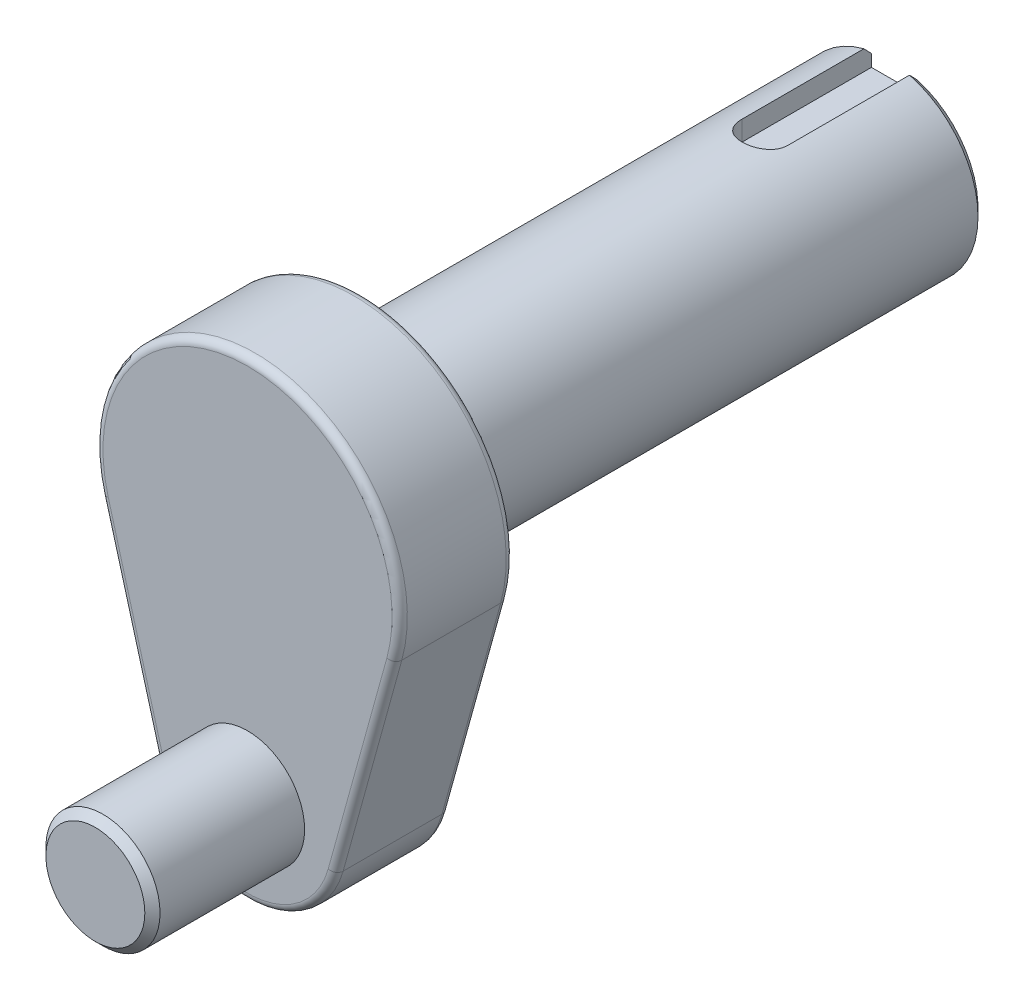
ISO-10303-21;
HEADER;
FILE_DESCRIPTION(('STEP AP214'),'2;1');
FILE_NAME('part.step','',(''),(''),'','','');
FILE_SCHEMA(('AUTOMOTIVE_DESIGN { 1 0 10303 214 1 1 1 1 }'));
ENDSEC;
DATA;
#1=APPLICATION_CONTEXT('core data for automotive mechanical design processes');
#2=APPLICATION_PROTOCOL_DEFINITION('international standard','automotive_design',2000,#1);
#3=PRODUCT_CONTEXT('',#1,'mechanical');
#4=PRODUCT('Part','Part','',(#3));
#5=PRODUCT_RELATED_PRODUCT_CATEGORY('part','',(#4));
#6=PRODUCT_DEFINITION_FORMATION('','',#4);
#7=PRODUCT_DEFINITION_CONTEXT('part definition',#1,'design');
#8=PRODUCT_DEFINITION('design','',#6,#7);
#9=PRODUCT_DEFINITION_SHAPE('','',#8);
#10=(LENGTH_UNIT() NAMED_UNIT(*) SI_UNIT(.MILLI.,.METRE.));
#11=(NAMED_UNIT(*) PLANE_ANGLE_UNIT() SI_UNIT($,.RADIAN.));
#12=(NAMED_UNIT(*) SI_UNIT($,.STERADIAN.) SOLID_ANGLE_UNIT());
#13=UNCERTAINTY_MEASURE_WITH_UNIT(LENGTH_MEASURE(1.E-05),#10,'distance_accuracy_value','');
#14=(GEOMETRIC_REPRESENTATION_CONTEXT(3) GLOBAL_UNCERTAINTY_ASSIGNED_CONTEXT((#13)) GLOBAL_UNIT_ASSIGNED_CONTEXT((#10,
#11,#12)) REPRESENTATION_CONTEXT('',''));
#15=CARTESIAN_POINT('',(0.,0.,0.));
#16=DIRECTION('',(0.,0.,1.));
#17=DIRECTION('',(1.,0.,0.));
#18=AXIS2_PLACEMENT_3D('',#15,#16,#17);
#19=CARTESIAN_POINT('',(0.,5.80947501931113,-26.5));
#20=DIRECTION('',(0.,1.,0.));
#21=DIRECTION('',(0.,0.,1.));
#22=AXIS2_PLACEMENT_3D('',#19,#20,#21);
#23=CYLINDRICAL_SURFACE('',#22,1.5);
#24=DIRECTION('',(0.,1.,0.));
#25=VECTOR('',#24,1.);
#26=CARTESIAN_POINT('',(-1.5,7.50000000000001,-26.5));
#27=LINE('',#26,#25);
#28=CARTESIAN_POINT('',(-1.5,5.80947501931113,-26.5));
#29=VERTEX_POINT('',#28);
#30=CARTESIAN_POINT('',(-1.5,4.5,-26.5));
#31=VERTEX_POINT('',#30);
#32=EDGE_CURVE('E390',#29,#31,#27,.F.);
#33=ORIENTED_EDGE('',*,*,#32,.F.);
#34=CARTESIAN_POINT('',(1.5,5.80947501931111,-26.5));
#35=CARTESIAN_POINT('',(1.50000050524923,5.80947222867943,-26.4585055571708));
#36=CARTESIAN_POINT('',(1.49827711346028,5.8099201484777,-26.4170316750747));
#37=CARTESIAN_POINT('',(1.49140695796285,5.81168856794097,-26.3343940851127));
#38=CARTESIAN_POINT('',(1.4862607702814,5.81300892078276,-26.2932303262343));
#39=CARTESIAN_POINT('',(1.46576289126512,5.8182256559059,-26.1708203749852));
#40=CARTESIAN_POINT('',(1.44535155552794,5.82337804135511,-26.0904153630816));
#41=CARTESIAN_POINT('',(1.39169664999631,5.83643145456575,-25.9343116096195));
#42=CARTESIAN_POINT('',(1.35845407001292,5.8443322703067,-25.8586125055667));
#43=CARTESIAN_POINT('',(1.28012142761861,5.86198736230108,-25.7138303703552));
#44=CARTESIAN_POINT('',(1.23502860644179,5.87174206999863,-25.6447488849113));
#45=CARTESIAN_POINT('',(1.1332319688719,5.89224290917559,-25.5136907703432));
#46=CARTESIAN_POINT('',(1.07631780220301,5.90300473123246,-25.4518800320828));
#47=CARTESIAN_POINT('',(0.952926341290179,5.92417448469618,-25.3385570685535));
#48=CARTESIAN_POINT('',(0.88644562907482,5.93458228796763,-25.2870485398838));
#49=CARTESIAN_POINT('',(0.744651529893638,5.95404769921051,-25.1951104129951));
#50=CARTESIAN_POINT('',(0.669225052680382,5.96308378123932,-25.1548504608458));
#51=CARTESIAN_POINT('',(0.512463474576597,5.97859165785743,-25.0876847147731));
#52=CARTESIAN_POINT('',(0.431135590578427,5.98506652406555,-25.0607629148016));
#53=CARTESIAN_POINT('',(0.291167603440451,5.99320337580397,-25.027365800933));
#54=CARTESIAN_POINT('',(0.233449377030623,5.99573891848001,-25.017121309968));
#55=CARTESIAN_POINT('',(0.117162004167823,5.99913797373967,-25.0034371887798));
#56=CARTESIAN_POINT('',(0.0585928701337026,6.00000151070128,-24.9999974593426));
#57=CARTESIAN_POINT('',(-0.082847618974071,5.99999786393799,-25.0000035923725));
#58=CARTESIAN_POINT('',(-0.165742692717238,5.9982662677415,-25.0068891973278));
#59=CARTESIAN_POINT('',(-0.329178448850621,5.99152326745466,-25.0342169072882));
#60=CARTESIAN_POINT('',(-0.409716811091393,5.98650873780841,-25.0546719314673));
#61=CARTESIAN_POINT('',(-0.566022324045833,5.97375602287717,-25.1084401334819));
#62=CARTESIAN_POINT('',(-0.641795822888291,5.9660215559967,-25.1417357630046));
#63=CARTESIAN_POINT('',(-0.786676474014416,5.9486528792089,-25.220184083389));
#64=CARTESIAN_POINT('',(-0.855783795796267,5.93901871762332,-25.265336472665));
#65=CARTESIAN_POINT('',(-0.986800306585114,5.91867437595091,-25.3671994555513));
#66=CARTESIAN_POINT('',(-1.04855272336329,5.90794759014857,-25.4241083767118));
#67=CARTESIAN_POINT('',(-1.16174664413941,5.88673666629444,-25.5474496827367));
#68=CARTESIAN_POINT('',(-1.213186506477,5.87625256711063,-25.6138835810042));
#69=CARTESIAN_POINT('',(-1.30503992634644,5.85654489816704,-25.755614268944));
#70=CARTESIAN_POINT('',(-1.34527483807535,5.8473428055162,-25.831029969388));
#71=CARTESIAN_POINT('',(-1.41241423980361,5.83149065240361,-25.9878049420868));
#72=CARTESIAN_POINT('',(-1.43932873841843,5.82483867669934,-26.0691596989821));
#73=CARTESIAN_POINT('',(-1.47268958608266,5.81647517608708,-26.2091256997767));
#74=CARTESIAN_POINT('',(-1.48291503731536,5.81386697661189,-26.2668105309544));
#75=CARTESIAN_POINT('',(-1.49657449812415,5.81035954220756,-26.3829865321373));
#76=CARTESIAN_POINT('',(-1.50001339891543,5.80945907649565,-26.441477090798));
#77=CARTESIAN_POINT('',(-1.5,5.80947501931113,-26.5));
#78=B_SPLINE_CURVE_WITH_KNOTS('',3,(#34,#35,#36,#37,#38,#39,#40,#41,#42,#43,#44,#45,#46,#47,#48,
#49,#50,#51,#52,#53,#54,#55,#56,#57,#58,#59,#60,#61,#62,#63,#64,#65,#66,#67,#68,#69,#70,#71,#72,
#73,#74,#75,#76,#77),.UNSPECIFIED.,.F.,.F.,(4,2,2,2,2,2,2,2,2,2,2,2,2,2,2,2,2,2,2,2,2,4),(0.,
0.124404691229613,0.248788451518705,0.496844944064961,0.744882305184763,0.992977461256862,
1.24593774314179,1.49898862906734,1.75567193684104,2.0120464689173,2.18767408469901,
2.36329913979516,2.61162487659784,2.86018737936107,3.10841138690879,3.3566290813007,
3.60943765267769,3.86228643686803,4.11896167430954,4.37544375867517,4.55097061014466,
4.72637090930917),.UNSPECIFIED.);
#79=CARTESIAN_POINT('',(1.5,5.80947501931111,-26.5));
#80=VERTEX_POINT('',#79);
#81=EDGE_CURVE('E267',#29,#80,#78,.F.);
#82=ORIENTED_EDGE('',*,*,#81,.T.);
#83=DIRECTION('',(0.,1.,0.));
#84=VECTOR('',#83,1.);
#85=CARTESIAN_POINT('',(1.5,7.5,-26.5));
#86=LINE('',#85,#84);
#87=CARTESIAN_POINT('',(1.5,4.5,-26.5));
#88=VERTEX_POINT('',#87);
#89=EDGE_CURVE('E391',#88,#80,#86,.T.);
#90=ORIENTED_EDGE('',*,*,#89,.F.);
#91=CARTESIAN_POINT('',(0.,4.5,-26.5));
#92=DIRECTION('',(0.,-1.,0.));
#93=DIRECTION('',(0.,0.,-1.));
#94=AXIS2_PLACEMENT_3D('',#91,#92,#93);
#95=CIRCLE('',#94,1.5);
#96=EDGE_CURVE('E145',#31,#88,#95,.F.);
#97=ORIENTED_EDGE('',*,*,#96,.F.);
#98=EDGE_LOOP('',(#33,#82,#90,#97));
#99=FACE_BOUND('',#98,.T.);
#100=ADVANCED_FACE('F40',(#99),#23,.F.);
#101=CARTESIAN_POINT('',(0.,0.,-35.));
#102=DIRECTION('',(0.,0.,1.));
#103=DIRECTION('',(1.,0.,0.));
#104=AXIS2_PLACEMENT_3D('',#101,#102,#103);
#105=CYLINDRICAL_SURFACE('',#104,6.);
#106=ORIENTED_EDGE('',*,*,#81,.F.);
#107=DIRECTION('',(0.,0.,1.));
#108=VECTOR('',#107,1.);
#109=CARTESIAN_POINT('',(-1.5,5.80947501931113,-35.));
#110=LINE('',#109,#108);
#111=CARTESIAN_POINT('',(-1.5,5.80947501931113,-34.5));
#112=VERTEX_POINT('',#111);
#113=EDGE_CURVE('E168',#112,#29,#110,.T.);
#114=ORIENTED_EDGE('',*,*,#113,.F.);
#115=CARTESIAN_POINT('',(0.,0.,-34.5));
#116=DIRECTION('',(0.,0.,1.));
#117=DIRECTION('',(1.,0.,0.));
#118=AXIS2_PLACEMENT_3D('',#115,#116,#117);
#119=CIRCLE('',#118,6.);
#120=CARTESIAN_POINT('',(1.5,5.80947501931111,-34.5));
#121=VERTEX_POINT('',#120);
#122=EDGE_CURVE('E196',#112,#121,#119,.T.);
#123=ORIENTED_EDGE('',*,*,#122,.T.);
#124=DIRECTION('',(0.,0.,1.));
#125=VECTOR('',#124,1.);
#126=CARTESIAN_POINT('',(1.5,5.80947501931111,-35.));
#127=LINE('',#126,#125);
#128=EDGE_CURVE('E165',#80,#121,#127,.F.);
#129=ORIENTED_EDGE('',*,*,#128,.F.);
#130=EDGE_LOOP('',(#106,#114,#123,#129));
#131=FACE_BOUND('',#130,.T.);
#132=CARTESIAN_POINT('',(0.,0.,0.));
#133=DIRECTION('',(0.,0.,1.));
#134=DIRECTION('',(1.,0.,0.));
#135=AXIS2_PLACEMENT_3D('',#132,#133,#134);
#136=CIRCLE('',#135,6.);
#137=CARTESIAN_POINT('',(6.00000000000001,0.,0.));
#138=VERTEX_POINT('',#137);
#139=EDGE_CURVE('E186',#138,#138,#136,.T.);
#140=ORIENTED_EDGE('',*,*,#139,.F.);
#141=EDGE_LOOP('',(#140));
#142=FACE_BOUND('',#141,.T.);
#143=ADVANCED_FACE('F262',(#131,#142),#105,.T.);
#144=CARTESIAN_POINT('',(0.,0.,-35.));
#145=DIRECTION('',(0.,0.,1.));
#146=DIRECTION('',(1.,0.,0.));
#147=AXIS2_PLACEMENT_3D('',#144,#145,#146);
#148=PLANE('',#147);
#149=CARTESIAN_POINT('',(0.,0.,-35.));
#150=DIRECTION('',(0.,0.,1.));
#151=DIRECTION('',(1.,0.,0.));
#152=AXIS2_PLACEMENT_3D('',#149,#150,#151);
#153=CIRCLE('',#152,5.50000000000001);
#154=CARTESIAN_POINT('',(1.5,5.29150262212917,-35.));
#155=VERTEX_POINT('',#154);
#156=CARTESIAN_POINT('',(-1.5,5.29150262212918,-35.));
#157=VERTEX_POINT('',#156);
#158=EDGE_CURVE('E199',#155,#157,#153,.F.);
#159=ORIENTED_EDGE('',*,*,#158,.T.);
#160=DIRECTION('',(0.,1.,0.));
#161=VECTOR('',#160,1.);
#162=CARTESIAN_POINT('',(-1.5,7.50000000000001,-35.));
#163=LINE('',#162,#161);
#164=CARTESIAN_POINT('',(-1.5,4.5,-35.));
#165=VERTEX_POINT('',#164);
#166=EDGE_CURVE('E159',#165,#157,#163,.T.);
#167=ORIENTED_EDGE('',*,*,#166,.F.);
#168=DIRECTION('',(-1.,0.,0.));
#169=VECTOR('',#168,1.);
#170=CARTESIAN_POINT('',(1.5,4.5,-35.));
#171=LINE('',#170,#169);
#172=CARTESIAN_POINT('',(1.5,4.5,-35.));
#173=VERTEX_POINT('',#172);
#174=EDGE_CURVE('E143',#173,#165,#171,.T.);
#175=ORIENTED_EDGE('',*,*,#174,.F.);
#176=DIRECTION('',(0.,-1.,0.));
#177=VECTOR('',#176,1.);
#178=CARTESIAN_POINT('',(1.5,7.5,-35.));
#179=LINE('',#178,#177);
#180=EDGE_CURVE('E152',#155,#173,#179,.T.);
#181=ORIENTED_EDGE('',*,*,#180,.F.);
#182=EDGE_LOOP('',(#159,#167,#175,#181));
#183=FACE_BOUND('',#182,.T.);
#184=ADVANCED_FACE('F161',(#183),#148,.F.);
#185=CARTESIAN_POINT('',(0.,-15.,7.5));
#186=DIRECTION('',(0.,0.,-1.));
#187=DIRECTION('',(-1.,0.,0.));
#188=AXIS2_PLACEMENT_3D('',#185,#186,#187);
#189=CYLINDRICAL_SURFACE('',#188,6.);
#190=DIRECTION('',(0.,0.,-1.));
#191=VECTOR('',#190,1.);
#192=CARTESIAN_POINT('',(5.78273291792039,-16.6,7.5));
#193=LINE('',#192,#191);
#194=CARTESIAN_POINT('',(5.78273291792039,-16.6,7.));
#195=VERTEX_POINT('',#194);
#196=CARTESIAN_POINT('',(5.78273291792039,-16.6,0.5));
#197=VERTEX_POINT('',#196);
#198=EDGE_CURVE('E183',#195,#197,#193,.T.);
#199=ORIENTED_EDGE('',*,*,#198,.F.);
#200=CARTESIAN_POINT('',(0.,-15.,7.));
#201=DIRECTION('',(0.,0.,1.));
#202=DIRECTION('',(1.,0.,0.));
#203=AXIS2_PLACEMENT_3D('',#200,#201,#202);
#204=CIRCLE('',#203,6.);
#205=CARTESIAN_POINT('',(-5.78273291792039,-16.6,7.));
#206=VERTEX_POINT('',#205);
#207=EDGE_CURVE('E348',#195,#206,#204,.F.);
#208=ORIENTED_EDGE('',*,*,#207,.T.);
#209=DIRECTION('',(0.,0.,-1.));
#210=VECTOR('',#209,1.);
#211=CARTESIAN_POINT('',(-5.78273291792039,-16.6,7.5));
#212=LINE('',#211,#210);
#213=CARTESIAN_POINT('',(-5.78273291792039,-16.6,0.5));
#214=VERTEX_POINT('',#213);
#215=EDGE_CURVE('E174',#206,#214,#212,.T.);
#216=ORIENTED_EDGE('',*,*,#215,.T.);
#217=CARTESIAN_POINT('',(0.,-15.,0.5));
#218=DIRECTION('',(0.,0.,1.));
#219=DIRECTION('',(1.,0.,0.));
#220=AXIS2_PLACEMENT_3D('',#217,#218,#219);
#221=CIRCLE('',#220,6.);
#222=EDGE_CURVE('E315',#214,#197,#221,.T.);
#223=ORIENTED_EDGE('',*,*,#222,.T.);
#224=EDGE_LOOP('',(#199,#208,#216,#223));
#225=FACE_BOUND('',#224,.T.);
#226=ADVANCED_FACE('F255',(#225),#189,.T.);
#227=CARTESIAN_POINT('',(9.63788819653399,-2.66666666666669,7.5));
#228=DIRECTION('',(-0.963788819653399,0.266666666666667,0.));
#229=DIRECTION('',(-0.266666666666667,-0.963788819653399,0.));
#230=AXIS2_PLACEMENT_3D('',#227,#228,#229);
#231=PLANE('',#230);
#232=DIRECTION('',(0.,0.,-1.));
#233=VECTOR('',#232,1.);
#234=CARTESIAN_POINT('',(9.63788819653399,-2.66666666666669,7.5));
#235=LINE('',#234,#233);
#236=CARTESIAN_POINT('',(9.63788819653399,-2.66666666666669,7.));
#237=VERTEX_POINT('',#236);
#238=CARTESIAN_POINT('',(9.63788819653399,-2.66666666666669,0.5));
#239=VERTEX_POINT('',#238);
#240=EDGE_CURVE('E180',#237,#239,#235,.T.);
#241=ORIENTED_EDGE('',*,*,#240,.F.);
#242=DIRECTION('',(0.266666666666667,0.963788819653399,0.));
#243=VECTOR('',#242,1.);
#244=CARTESIAN_POINT('',(5.78273291792039,-16.6,7.));
#245=LINE('',#244,#243);
#246=EDGE_CURVE('E351',#237,#195,#245,.F.);
#247=ORIENTED_EDGE('',*,*,#246,.T.);
#248=ORIENTED_EDGE('',*,*,#198,.T.);
#249=DIRECTION('',(0.266666666666667,0.963788819653399,0.));
#250=VECTOR('',#249,1.);
#251=CARTESIAN_POINT('',(9.63788819653399,-2.66666666666669,0.5));
#252=LINE('',#251,#250);
#253=EDGE_CURVE('E354',#197,#239,#252,.T.);
#254=ORIENTED_EDGE('',*,*,#253,.T.);
#255=EDGE_LOOP('',(#241,#247,#248,#254));
#256=FACE_BOUND('',#255,.T.);
#257=ADVANCED_FACE('F251',(#256),#231,.F.);
#258=CARTESIAN_POINT('',(0.,0.,7.5));
#259=DIRECTION('',(0.,0.,-1.));
#260=DIRECTION('',(-1.,0.,0.));
#261=AXIS2_PLACEMENT_3D('',#258,#259,#260);
#262=CYLINDRICAL_SURFACE('',#261,10.);
#263=DIRECTION('',(0.,0.,-1.));
#264=VECTOR('',#263,1.);
#265=CARTESIAN_POINT('',(-9.63788819653399,-2.66666666666669,7.5));
#266=LINE('',#265,#264);
#267=CARTESIAN_POINT('',(-9.63788819653399,-2.66666666666669,7.));
#268=VERTEX_POINT('',#267);
#269=CARTESIAN_POINT('',(-9.63788819653399,-2.66666666666669,0.5));
#270=VERTEX_POINT('',#269);
#271=EDGE_CURVE('E177',#268,#270,#266,.T.);
#272=ORIENTED_EDGE('',*,*,#271,.F.);
#273=CARTESIAN_POINT('',(0.,0.,7.));
#274=DIRECTION('',(0.,0.,1.));
#275=DIRECTION('',(1.,0.,0.));
#276=AXIS2_PLACEMENT_3D('',#273,#274,#275);
#277=CIRCLE('',#276,10.);
#278=EDGE_CURVE('E11',#268,#237,#277,.F.);
#279=ORIENTED_EDGE('',*,*,#278,.T.);
#280=ORIENTED_EDGE('',*,*,#240,.T.);
#281=CARTESIAN_POINT('',(0.,0.,0.5));
#282=DIRECTION('',(0.,0.,1.));
#283=DIRECTION('',(1.,0.,0.));
#284=AXIS2_PLACEMENT_3D('',#281,#282,#283);
#285=CIRCLE('',#284,10.);
#286=EDGE_CURVE('E49',#239,#270,#285,.T.);
#287=ORIENTED_EDGE('',*,*,#286,.T.);
#288=EDGE_LOOP('',(#272,#279,#280,#287));
#289=FACE_BOUND('',#288,.T.);
#290=ADVANCED_FACE('F247',(#289),#262,.T.);
#291=CARTESIAN_POINT('',(-9.63788819653399,-2.66666666666669,7.5));
#292=DIRECTION('',(0.963788819653399,0.266666666666667,0.));
#293=DIRECTION('',(-0.266666666666667,0.963788819653399,0.));
#294=AXIS2_PLACEMENT_3D('',#291,#292,#293);
#295=PLANE('',#294);
#296=ORIENTED_EDGE('',*,*,#215,.F.);
#297=DIRECTION('',(0.266666666666667,-0.963788819653399,0.));
#298=VECTOR('',#297,1.);
#299=CARTESIAN_POINT('',(-9.63788819653399,-2.66666666666669,7.));
#300=LINE('',#299,#298);
#301=EDGE_CURVE('E344',#206,#268,#300,.F.);
#302=ORIENTED_EDGE('',*,*,#301,.T.);
#303=ORIENTED_EDGE('',*,*,#271,.T.);
#304=DIRECTION('',(0.266666666666667,-0.963788819653399,0.));
#305=VECTOR('',#304,1.);
#306=CARTESIAN_POINT('',(-9.63788819653399,-2.66666666666669,0.5));
#307=LINE('',#306,#305);
#308=EDGE_CURVE('E346',#270,#214,#307,.T.);
#309=ORIENTED_EDGE('',*,*,#308,.T.);
#310=EDGE_LOOP('',(#296,#302,#303,#309));
#311=FACE_BOUND('',#310,.T.);
#312=ADVANCED_FACE('F241',(#311),#295,.F.);
#313=CARTESIAN_POINT('',(0.,-15.,7.5));
#314=DIRECTION('',(0.,0.,1.));
#315=DIRECTION('',(1.,0.,0.));
#316=AXIS2_PLACEMENT_3D('',#313,#314,#315);
#317=PLANE('',#316);
#318=CARTESIAN_POINT('',(0.,-15.,7.5));
#319=DIRECTION('',(0.,0.,1.));
#320=DIRECTION('',(1.,0.,0.));
#321=AXIS2_PLACEMENT_3D('',#318,#319,#320);
#322=CIRCLE('',#321,5.5);
#323=CARTESIAN_POINT('',(-5.30083850809369,-16.4666666666667,7.5));
#324=VERTEX_POINT('',#323);
#325=CARTESIAN_POINT('',(5.30083850809369,-16.4666666666667,7.5));
#326=VERTEX_POINT('',#325);
#327=EDGE_CURVE('E360',#324,#326,#322,.T.);
#328=ORIENTED_EDGE('',*,*,#327,.T.);
#329=DIRECTION('',(0.266666666666667,0.963788819653399,0.));
#330=VECTOR('',#329,1.);
#331=CARTESIAN_POINT('',(9.15599378670728,-2.53333333333333,7.5));
#332=LINE('',#331,#330);
#333=CARTESIAN_POINT('',(9.15599378670728,-2.53333333333333,7.5));
#334=VERTEX_POINT('',#333);
#335=EDGE_CURVE('E357',#326,#334,#332,.T.);
#336=ORIENTED_EDGE('',*,*,#335,.T.);
#337=CARTESIAN_POINT('',(0.,0.,7.5));
#338=DIRECTION('',(0.,0.,1.));
#339=DIRECTION('',(1.,0.,0.));
#340=AXIS2_PLACEMENT_3D('',#337,#338,#339);
#341=CIRCLE('',#340,9.5);
#342=CARTESIAN_POINT('',(-9.15599378670728,-2.53333333333335,7.5));
#343=VERTEX_POINT('',#342);
#344=EDGE_CURVE('E274',#334,#343,#341,.T.);
#345=ORIENTED_EDGE('',*,*,#344,.T.);
#346=DIRECTION('',(0.266666666666667,-0.963788819653399,0.));
#347=VECTOR('',#346,1.);
#348=CARTESIAN_POINT('',(-5.30083850809369,-16.4666666666667,7.5));
#349=LINE('',#348,#347);
#350=EDGE_CURVE('E361',#343,#324,#349,.T.);
#351=ORIENTED_EDGE('',*,*,#350,.T.);
#352=EDGE_LOOP('',(#328,#336,#345,#351));
#353=FACE_BOUND('',#352,.T.);
#354=CARTESIAN_POINT('',(0.,-15.,7.5));
#355=DIRECTION('',(0.,0.,1.));
#356=DIRECTION('',(1.,0.,0.));
#357=AXIS2_PLACEMENT_3D('',#354,#355,#356);
#358=CIRCLE('',#357,3.75);
#359=CARTESIAN_POINT('',(3.75000000000001,-15.,7.5));
#360=VERTEX_POINT('',#359);
#361=EDGE_CURVE('E171',#360,#360,#358,.T.);
#362=ORIENTED_EDGE('',*,*,#361,.F.);
#363=EDGE_LOOP('',(#362));
#364=FACE_BOUND('',#363,.T.);
#365=ADVANCED_FACE('F238',(#353,#364),#317,.T.);
#366=CARTESIAN_POINT('',(0.,-15.,0.));
#367=DIRECTION('',(0.,0.,1.));
#368=DIRECTION('',(1.,0.,0.));
#369=AXIS2_PLACEMENT_3D('',#366,#367,#368);
#370=PLANE('',#369);
#371=CARTESIAN_POINT('',(0.,0.,0.));
#372=DIRECTION('',(0.,0.,1.));
#373=DIRECTION('',(1.,0.,0.));
#374=AXIS2_PLACEMENT_3D('',#371,#372,#373);
#375=CIRCLE('',#374,9.5);
#376=CARTESIAN_POINT('',(-9.15599378670728,-2.53333333333335,0.));
#377=VERTEX_POINT('',#376);
#378=CARTESIAN_POINT('',(9.15599378670728,-2.53333333333333,0.));
#379=VERTEX_POINT('',#378);
#380=EDGE_CURVE('E342',#377,#379,#375,.F.);
#381=ORIENTED_EDGE('',*,*,#380,.T.);
#382=DIRECTION('',(0.266666666666667,0.963788819653399,0.));
#383=VECTOR('',#382,1.);
#384=CARTESIAN_POINT('',(5.30083850809369,-16.4666666666667,0.));
#385=LINE('',#384,#383);
#386=CARTESIAN_POINT('',(5.30083850809369,-16.4666666666667,0.));
#387=VERTEX_POINT('',#386);
#388=EDGE_CURVE('E337',#379,#387,#385,.F.);
#389=ORIENTED_EDGE('',*,*,#388,.T.);
#390=CARTESIAN_POINT('',(0.,-15.,0.));
#391=DIRECTION('',(0.,0.,1.));
#392=DIRECTION('',(1.,0.,0.));
#393=AXIS2_PLACEMENT_3D('',#390,#391,#392);
#394=CIRCLE('',#393,5.5);
#395=CARTESIAN_POINT('',(-5.30083850809369,-16.4666666666667,0.));
#396=VERTEX_POINT('',#395);
#397=EDGE_CURVE('E64',#387,#396,#394,.F.);
#398=ORIENTED_EDGE('',*,*,#397,.T.);
#399=DIRECTION('',(0.266666666666667,-0.963788819653399,0.));
#400=VECTOR('',#399,1.);
#401=CARTESIAN_POINT('',(-5.30083850809369,-16.4666666666667,0.));
#402=LINE('',#401,#400);
#403=EDGE_CURVE('E340',#396,#377,#402,.F.);
#404=ORIENTED_EDGE('',*,*,#403,.T.);
#405=EDGE_LOOP('',(#381,#389,#398,#404));
#406=FACE_BOUND('',#405,.T.);
#407=ORIENTED_EDGE('',*,*,#139,.T.);
#408=EDGE_LOOP('',(#407));
#409=FACE_BOUND('',#408,.T.);
#410=ADVANCED_FACE('F236',(#406,#409),#370,.F.);
#411=CARTESIAN_POINT('',(0.,-15.,17.5));
#412=DIRECTION('',(0.,0.,-1.));
#413=DIRECTION('',(-1.,0.,0.));
#414=AXIS2_PLACEMENT_3D('',#411,#412,#413);
#415=CYLINDRICAL_SURFACE('',#414,3.75);
#416=CARTESIAN_POINT('',(0.,-15.,17.));
#417=DIRECTION('',(0.,0.,1.));
#418=DIRECTION('',(1.,0.,0.));
#419=AXIS2_PLACEMENT_3D('',#416,#417,#418);
#420=CIRCLE('',#419,3.75);
#421=CARTESIAN_POINT('',(3.75000000000001,-15.,17.));
#422=VERTEX_POINT('',#421);
#423=EDGE_CURVE('E193',#422,#422,#420,.F.);
#424=ORIENTED_EDGE('',*,*,#423,.T.);
#425=EDGE_LOOP('',(#424));
#426=FACE_BOUND('',#425,.T.);
#427=ORIENTED_EDGE('',*,*,#361,.T.);
#428=EDGE_LOOP('',(#427));
#429=FACE_BOUND('',#428,.T.);
#430=ADVANCED_FACE('F232',(#426,#429),#415,.T.);
#431=CARTESIAN_POINT('',(0.,-15.,17.5));
#432=DIRECTION('',(0.,0.,1.));
#433=DIRECTION('',(1.,0.,0.));
#434=AXIS2_PLACEMENT_3D('',#431,#432,#433);
#435=PLANE('',#434);
#436=CARTESIAN_POINT('',(0.,-15.,17.5));
#437=DIRECTION('',(0.,0.,1.));
#438=DIRECTION('',(1.,0.,0.));
#439=AXIS2_PLACEMENT_3D('',#436,#437,#438);
#440=CIRCLE('',#439,3.25000000000002);
#441=CARTESIAN_POINT('',(3.25000000000002,-15.,17.5));
#442=VERTEX_POINT('',#441);
#443=EDGE_CURVE('E190',#442,#442,#440,.T.);
#444=ORIENTED_EDGE('',*,*,#443,.T.);
#445=EDGE_LOOP('',(#444));
#446=FACE_BOUND('',#445,.T.);
#447=ADVANCED_FACE('F228',(#446),#435,.T.);
#448=CARTESIAN_POINT('',(0.,-15.,17.5));
#449=DIRECTION('',(0.,0.,-1.));
#450=DIRECTION('',(-1.,0.,0.));
#451=AXIS2_PLACEMENT_3D('',#448,#449,#450);
#452=CONICAL_SURFACE('',#451,3.25000000000002,0.785398163397442);
#453=ORIENTED_EDGE('',*,*,#423,.F.);
#454=EDGE_LOOP('',(#453));
#455=FACE_BOUND('',#454,.T.);
#456=ORIENTED_EDGE('',*,*,#443,.F.);
#457=EDGE_LOOP('',(#456));
#458=FACE_BOUND('',#457,.T.);
#459=ADVANCED_FACE('F231',(#455,#458),#452,.T.);
#460=CARTESIAN_POINT('',(0.,0.,-34.5));
#461=DIRECTION('',(0.,0.,1.));
#462=DIRECTION('',(1.,0.,0.));
#463=AXIS2_PLACEMENT_3D('',#460,#461,#462);
#464=CONICAL_SURFACE('',#463,6.,0.785398163397451);
#465=CARTESIAN_POINT('',(-1.5,3.24450834045896,-36.925530197175));
#466=CARTESIAN_POINT('',(-1.5,3.33981413240216,-36.8390111595844));
#467=CARTESIAN_POINT('',(-1.5,3.43479645114667,-36.7521376764056));
#468=CARTESIAN_POINT('',(-1.5,3.62422217448633,-36.5778073070405));
#469=CARTESIAN_POINT('',(-1.5,3.71866558594787,-36.4903504283185));
#470=CARTESIAN_POINT('',(-1.5,4.00134574924301,-36.2272964736999));
#471=CARTESIAN_POINT('',(-1.5,4.1889398881949,-36.051009273685));
#472=CARTESIAN_POINT('',(-1.5,4.56294145622766,-35.6972110562471));
#473=CARTESIAN_POINT('',(-1.5,4.74934897210819,-35.5197001303631));
#474=CARTESIAN_POINT('',(-1.5,5.12132534145482,-35.1637979720924));
#475=CARTESIAN_POINT('',(-1.5,5.30689418504689,-34.9854067293928));
#476=CARTESIAN_POINT('',(-1.5,5.67739542249315,-34.6279950875884));
#477=CARTESIAN_POINT('',(-1.5,5.86232786679039,-34.4489747407328));
#478=CARTESIAN_POINT('',(-1.5,6.23172057360531,-34.0904471154343));
#479=CARTESIAN_POINT('',(-1.5,6.41618083530585,-33.9109398361497));
#480=CARTESIAN_POINT('',(-1.5,6.78474821858431,-33.5515372041244));
#481=CARTESIAN_POINT('',(-1.5,6.96885531425333,-33.3716418248252));
#482=CARTESIAN_POINT('',(-1.5,7.33677451497168,-33.0115512458126));
#483=CARTESIAN_POINT('',(-1.5,7.52058662131918,-32.8313560474258));
#484=CARTESIAN_POINT('',(-1.5,7.70428766464532,-32.6510479413105));
#485=B_SPLINE_CURVE_WITH_KNOTS('',3,(#465,#466,#467,#468,#469,#470,#471,#472,#473,#474,#475,
#476,#477,#478,#479,#480,#481,#482,#483,#484),.UNSPECIFIED.,.F.,.F.,(4,2,2,2,2,2,2,2,2,4),(0.,
0.386156065398596,0.772307199632783,1.54457917980293,2.31679400491703,3.089017898073,
3.86117910338362,4.63334164404692,5.40555881703813,6.17777258236823),.UNSPECIFIED.);
#486=EDGE_CURVE('E208',#157,#112,#485,.T.);
#487=ORIENTED_EDGE('',*,*,#486,.F.);
#488=ORIENTED_EDGE('',*,*,#158,.F.);
#489=CARTESIAN_POINT('',(1.5,7.70428766464532,-32.6510479413105));
#490=CARTESIAN_POINT('',(1.5,7.52058662131918,-32.8313560474258));
#491=CARTESIAN_POINT('',(1.5,7.33677451497168,-33.0115512458126));
#492=CARTESIAN_POINT('',(1.5,6.96885531425332,-33.3716418248252));
#493=CARTESIAN_POINT('',(1.5,6.7847482185843,-33.5515372041244));
#494=CARTESIAN_POINT('',(1.5,6.41618083530585,-33.9109398361497));
#495=CARTESIAN_POINT('',(1.5,6.2317205736053,-34.0904471154343));
#496=CARTESIAN_POINT('',(1.5,5.86232786679039,-34.4489747407328));
#497=CARTESIAN_POINT('',(1.5,5.67739542249315,-34.6279950875884));
#498=CARTESIAN_POINT('',(1.5,5.30689418504688,-34.9854067293929));
#499=CARTESIAN_POINT('',(1.5,5.12132534145482,-35.1637979720924));
#500=CARTESIAN_POINT('',(1.5,4.74934897210819,-35.5197001303631));
#501=CARTESIAN_POINT('',(1.5,4.56294145622767,-35.6972110562471));
#502=CARTESIAN_POINT('',(1.5,4.18893988819491,-36.051009273685));
#503=CARTESIAN_POINT('',(1.5,4.00134574924302,-36.2272964736999));
#504=CARTESIAN_POINT('',(1.5,3.71866558594788,-36.4903504283184));
#505=CARTESIAN_POINT('',(1.5,3.62422217448635,-36.5778073070405));
#506=CARTESIAN_POINT('',(1.5,3.43479645114668,-36.7521376764056));
#507=CARTESIAN_POINT('',(1.5,3.33981413240218,-36.8390111595844));
#508=CARTESIAN_POINT('',(1.5,3.24450834045898,-36.925530197175));
#509=B_SPLINE_CURVE_WITH_KNOTS('',3,(#489,#490,#491,#492,#493,#494,#495,#496,#497,#498,#499,
#500,#501,#502,#503,#504,#505,#506,#507,#508),.UNSPECIFIED.,.F.,.F.,(4,2,2,2,2,2,2,2,2,4),(0.,
0.772213765330113,1.54443093832132,2.31659347898461,3.08875468429524,3.8609785774512,
4.63319340256529,5.40546538273543,5.79161651696962,6.17777258236821),.UNSPECIFIED.);
#510=EDGE_CURVE('E155',#121,#155,#509,.T.);
#511=ORIENTED_EDGE('',*,*,#510,.F.);
#512=ORIENTED_EDGE('',*,*,#122,.F.);
#513=EDGE_LOOP('',(#487,#488,#511,#512));
#514=FACE_BOUND('',#513,.T.);
#515=ADVANCED_FACE('F215',(#514),#464,.T.);
#516=CARTESIAN_POINT('',(-1.5,7.50000000000001,-25.));
#517=DIRECTION('',(-1.,0.,0.));
#518=DIRECTION('',(0.,0.,1.));
#519=AXIS2_PLACEMENT_3D('',#516,#517,#518);
#520=PLANE('',#519);
#521=ORIENTED_EDGE('',*,*,#113,.T.);
#522=ORIENTED_EDGE('',*,*,#32,.T.);
#523=DIRECTION('',(0.,0.,-1.));
#524=VECTOR('',#523,1.);
#525=CARTESIAN_POINT('',(-1.5,4.5,-25.));
#526=LINE('',#525,#524);
#527=EDGE_CURVE('E149',#31,#165,#526,.T.);
#528=ORIENTED_EDGE('',*,*,#527,.T.);
#529=ORIENTED_EDGE('',*,*,#166,.T.);
#530=ORIENTED_EDGE('',*,*,#486,.T.);
#531=EDGE_LOOP('',(#521,#522,#528,#529,#530));
#532=FACE_BOUND('',#531,.T.);
#533=ADVANCED_FACE('F223',(#532),#520,.F.);
#534=CARTESIAN_POINT('',(1.5,4.5,-25.));
#535=DIRECTION('',(0.,-1.,0.));
#536=DIRECTION('',(0.,0.,-1.));
#537=AXIS2_PLACEMENT_3D('',#534,#535,#536);
#538=PLANE('',#537);
#539=ORIENTED_EDGE('',*,*,#527,.F.);
#540=ORIENTED_EDGE('',*,*,#96,.T.);
#541=DIRECTION('',(0.,0.,-1.));
#542=VECTOR('',#541,1.);
#543=CARTESIAN_POINT('',(1.5,4.5,-25.));
#544=LINE('',#543,#542);
#545=EDGE_CURVE('E138',#88,#173,#544,.T.);
#546=ORIENTED_EDGE('',*,*,#545,.T.);
#547=ORIENTED_EDGE('',*,*,#174,.T.);
#548=EDGE_LOOP('',(#539,#540,#546,#547));
#549=FACE_BOUND('',#548,.T.);
#550=ADVANCED_FACE('F141',(#549),#538,.F.);
#551=CARTESIAN_POINT('',(1.5,7.5,-25.));
#552=DIRECTION('',(1.,0.,0.));
#553=DIRECTION('',(0.,0.,-1.));
#554=AXIS2_PLACEMENT_3D('',#551,#552,#553);
#555=PLANE('',#554);
#556=ORIENTED_EDGE('',*,*,#545,.F.);
#557=ORIENTED_EDGE('',*,*,#89,.T.);
#558=ORIENTED_EDGE('',*,*,#128,.T.);
#559=ORIENTED_EDGE('',*,*,#510,.T.);
#560=ORIENTED_EDGE('',*,*,#180,.T.);
#561=EDGE_LOOP('',(#556,#557,#558,#559,#560));
#562=FACE_BOUND('',#561,.T.);
#563=ADVANCED_FACE('F153',(#562),#555,.F.);
#564=CARTESIAN_POINT('',(-5.30083850809369,-16.4666666666667,7.));
#565=DIRECTION('',(-0.266666666666667,0.963788819653399,0.));
#566=DIRECTION('',(-0.963788819653399,-0.266666666666667,0.));
#567=AXIS2_PLACEMENT_3D('',#564,#565,#566);
#568=CYLINDRICAL_SURFACE('',#567,0.5);
#569=CARTESIAN_POINT('',(-9.15599378670728,-2.53333333333335,7.));
#570=DIRECTION('',(-0.266666666666667,0.963788819653399,0.));
#571=DIRECTION('',(-0.963788819653399,-0.266666666666667,0.));
#572=AXIS2_PLACEMENT_3D('',#569,#570,#571);
#573=CIRCLE('',#572,0.5);
#574=EDGE_CURVE('E332',#268,#343,#573,.T.);
#575=ORIENTED_EDGE('',*,*,#574,.F.);
#576=ORIENTED_EDGE('',*,*,#301,.F.);
#577=CARTESIAN_POINT('',(-5.30083850809369,-16.4666666666667,7.));
#578=DIRECTION('',(0.266666666666666,-0.963788819653399,0.));
#579=DIRECTION('',(0.963788819653399,0.266666666666666,0.));
#580=AXIS2_PLACEMENT_3D('',#577,#578,#579);
#581=CIRCLE('',#580,0.5);
#582=EDGE_CURVE('E329',#324,#206,#581,.T.);
#583=ORIENTED_EDGE('',*,*,#582,.F.);
#584=ORIENTED_EDGE('',*,*,#350,.F.);
#585=EDGE_LOOP('',(#575,#576,#583,#584));
#586=FACE_BOUND('',#585,.T.);
#587=ADVANCED_FACE('F222',(#586),#568,.T.);
#588=CARTESIAN_POINT('',(0.,-15.,7.));
#589=DIRECTION('',(0.,0.,1.));
#590=DIRECTION('',(1.,0.,0.));
#591=AXIS2_PLACEMENT_3D('',#588,#589,#590);
#592=TOROIDAL_SURFACE('',#591,5.5,0.5);
#593=ORIENTED_EDGE('',*,*,#582,.T.);
#594=ORIENTED_EDGE('',*,*,#207,.F.);
#595=CARTESIAN_POINT('',(5.30083850809369,-16.4666666666667,7.));
#596=DIRECTION('',(0.266666666666665,0.963788819653399,0.));
#597=DIRECTION('',(-0.963788819653399,0.266666666666665,0.));
#598=AXIS2_PLACEMENT_3D('',#595,#596,#597);
#599=CIRCLE('',#598,0.5);
#600=EDGE_CURVE('E319',#326,#195,#599,.T.);
#601=ORIENTED_EDGE('',*,*,#600,.F.);
#602=ORIENTED_EDGE('',*,*,#327,.F.);
#603=EDGE_LOOP('',(#593,#594,#601,#602));
#604=FACE_BOUND('',#603,.T.);
#605=ADVANCED_FACE('F291',(#604),#592,.T.);
#606=CARTESIAN_POINT('',(0.,0.,7.));
#607=DIRECTION('',(0.,0.,1.));
#608=DIRECTION('',(1.,0.,0.));
#609=AXIS2_PLACEMENT_3D('',#606,#607,#608);
#610=TOROIDAL_SURFACE('',#609,9.5,0.5);
#611=ORIENTED_EDGE('',*,*,#574,.T.);
#612=ORIENTED_EDGE('',*,*,#344,.F.);
#613=CARTESIAN_POINT('',(9.15599378670728,-2.53333333333333,7.));
#614=DIRECTION('',(-0.266666666666667,-0.963788819653399,0.));
#615=DIRECTION('',(0.963788819653399,-0.266666666666667,0.));
#616=AXIS2_PLACEMENT_3D('',#613,#614,#615);
#617=CIRCLE('',#616,0.5);
#618=EDGE_CURVE('E317',#237,#334,#617,.T.);
#619=ORIENTED_EDGE('',*,*,#618,.F.);
#620=ORIENTED_EDGE('',*,*,#278,.F.);
#621=EDGE_LOOP('',(#611,#612,#619,#620));
#622=FACE_BOUND('',#621,.T.);
#623=ADVANCED_FACE('F287',(#622),#610,.T.);
#624=CARTESIAN_POINT('',(5.30083850809369,-16.4666666666667,7.));
#625=DIRECTION('',(-0.266666666666667,-0.963788819653399,0.));
#626=DIRECTION('',(0.963788819653399,-0.266666666666667,0.));
#627=AXIS2_PLACEMENT_3D('',#624,#625,#626);
#628=CYLINDRICAL_SURFACE('',#627,0.5);
#629=ORIENTED_EDGE('',*,*,#600,.T.);
#630=ORIENTED_EDGE('',*,*,#246,.F.);
#631=ORIENTED_EDGE('',*,*,#618,.T.);
#632=ORIENTED_EDGE('',*,*,#335,.F.);
#633=EDGE_LOOP('',(#629,#630,#631,#632));
#634=FACE_BOUND('',#633,.T.);
#635=ADVANCED_FACE('F284',(#634),#628,.T.);
#636=CARTESIAN_POINT('',(-9.15599378670728,-2.53333333333335,0.5));
#637=DIRECTION('',(0.266666666666667,-0.963788819653399,0.));
#638=DIRECTION('',(0.963788819653399,0.266666666666667,0.));
#639=AXIS2_PLACEMENT_3D('',#636,#637,#638);
#640=CYLINDRICAL_SURFACE('',#639,0.5);
#641=CARTESIAN_POINT('',(-9.15599378670728,-2.53333333333335,0.5));
#642=DIRECTION('',(-0.266666666666667,0.963788819653399,0.));
#643=DIRECTION('',(-0.963788819653399,-0.266666666666667,0.));
#644=AXIS2_PLACEMENT_3D('',#641,#642,#643);
#645=CIRCLE('',#644,0.5);
#646=EDGE_CURVE('E318',#377,#270,#645,.T.);
#647=ORIENTED_EDGE('',*,*,#646,.F.);
#648=ORIENTED_EDGE('',*,*,#403,.F.);
#649=CARTESIAN_POINT('',(-5.30083850809369,-16.4666666666667,0.5));
#650=DIRECTION('',(0.266666666666665,-0.963788819653399,0.));
#651=DIRECTION('',(0.963788819653399,0.266666666666666,0.));
#652=AXIS2_PLACEMENT_3D('',#649,#650,#651);
#653=CIRCLE('',#652,0.5);
#654=EDGE_CURVE('E44',#214,#396,#653,.T.);
#655=ORIENTED_EDGE('',*,*,#654,.F.);
#656=ORIENTED_EDGE('',*,*,#308,.F.);
#657=EDGE_LOOP('',(#647,#648,#655,#656));
#658=FACE_BOUND('',#657,.T.);
#659=ADVANCED_FACE('F42',(#658),#640,.T.);
#660=CARTESIAN_POINT('',(0.,-15.,0.5));
#661=DIRECTION('',(0.,0.,1.));
#662=DIRECTION('',(1.,0.,0.));
#663=AXIS2_PLACEMENT_3D('',#660,#661,#662);
#664=TOROIDAL_SURFACE('',#663,5.5,0.5);
#665=ORIENTED_EDGE('',*,*,#654,.T.);
#666=ORIENTED_EDGE('',*,*,#397,.F.);
#667=CARTESIAN_POINT('',(5.30083850809369,-16.4666666666667,0.5));
#668=DIRECTION('',(0.266666666666665,0.963788819653399,0.));
#669=DIRECTION('',(-0.963788819653399,0.266666666666665,0.));
#670=AXIS2_PLACEMENT_3D('',#667,#668,#669);
#671=CIRCLE('',#670,0.5);
#672=EDGE_CURVE('E57',#197,#387,#671,.T.);
#673=ORIENTED_EDGE('',*,*,#672,.F.);
#674=ORIENTED_EDGE('',*,*,#222,.F.);
#675=EDGE_LOOP('',(#665,#666,#673,#674));
#676=FACE_BOUND('',#675,.T.);
#677=ADVANCED_FACE('F304',(#676),#664,.T.);
#678=CARTESIAN_POINT('',(0.,0.,0.5));
#679=DIRECTION('',(0.,0.,1.));
#680=DIRECTION('',(1.,0.,0.));
#681=AXIS2_PLACEMENT_3D('',#678,#679,#680);
#682=TOROIDAL_SURFACE('',#681,9.5,0.5);
#683=ORIENTED_EDGE('',*,*,#646,.T.);
#684=ORIENTED_EDGE('',*,*,#286,.F.);
#685=CARTESIAN_POINT('',(9.15599378670728,-2.53333333333333,0.5));
#686=DIRECTION('',(-0.266666666666667,-0.963788819653399,0.));
#687=DIRECTION('',(0.963788819653399,-0.266666666666667,0.));
#688=AXIS2_PLACEMENT_3D('',#685,#686,#687);
#689=CIRCLE('',#688,0.5);
#690=EDGE_CURVE('E325',#379,#239,#689,.T.);
#691=ORIENTED_EDGE('',*,*,#690,.F.);
#692=ORIENTED_EDGE('',*,*,#380,.F.);
#693=EDGE_LOOP('',(#683,#684,#691,#692));
#694=FACE_BOUND('',#693,.T.);
#695=ADVANCED_FACE('F302',(#694),#682,.T.);
#696=CARTESIAN_POINT('',(9.15599378670728,-2.53333333333333,0.5));
#697=DIRECTION('',(0.266666666666667,0.963788819653399,0.));
#698=DIRECTION('',(-0.963788819653399,0.266666666666667,0.));
#699=AXIS2_PLACEMENT_3D('',#696,#697,#698);
#700=CYLINDRICAL_SURFACE('',#699,0.5);
#701=ORIENTED_EDGE('',*,*,#672,.T.);
#702=ORIENTED_EDGE('',*,*,#388,.F.);
#703=ORIENTED_EDGE('',*,*,#690,.T.);
#704=ORIENTED_EDGE('',*,*,#253,.F.);
#705=EDGE_LOOP('',(#701,#702,#703,#704));
#706=FACE_BOUND('',#705,.T.);
#707=ADVANCED_FACE('F299',(#706),#700,.T.);
#708=CLOSED_SHELL('',(#100,#143,#184,#226,#257,#290,#312,#365,#410,#430,#447,#459,#515,#533,
#550,#563,#587,#605,#623,#635,#659,#677,#695,#707));
#709=MANIFOLD_SOLID_BREP('B2',#708);
#710=ADVANCED_BREP_SHAPE_REPRESENTATION('',(#18,#709),#14);
#711=SHAPE_DEFINITION_REPRESENTATION(#9,#710);
ENDSEC;
END-ISO-10303-21;
